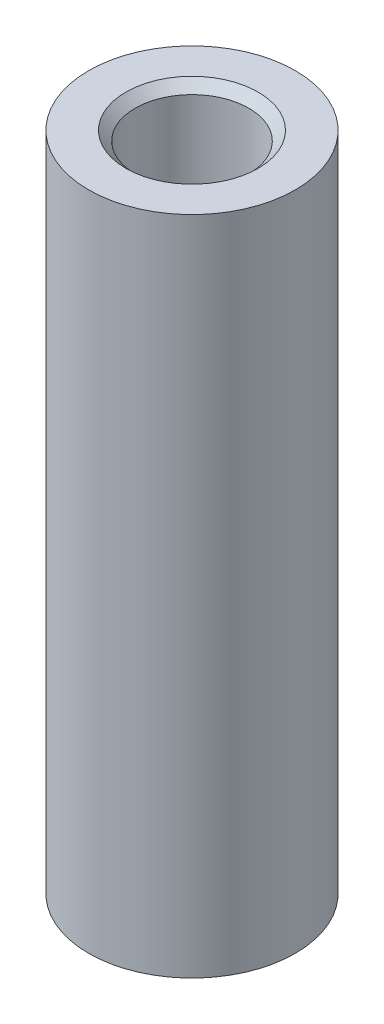
ISO-10303-21;
HEADER;
FILE_DESCRIPTION(('STEP AP214'),'2;1');
FILE_NAME('part.step','',(''),(''),'','','');
FILE_SCHEMA(('AUTOMOTIVE_DESIGN { 1 0 10303 214 1 1 1 1 }'));
ENDSEC;
DATA;
#1=APPLICATION_CONTEXT('core data for automotive mechanical design processes');
#2=APPLICATION_PROTOCOL_DEFINITION('international standard','automotive_design',2000,#1);
#3=PRODUCT_CONTEXT('',#1,'mechanical');
#4=PRODUCT('Part','Part','',(#3));
#5=PRODUCT_RELATED_PRODUCT_CATEGORY('part','',(#4));
#6=PRODUCT_DEFINITION_FORMATION('','',#4);
#7=PRODUCT_DEFINITION_CONTEXT('part definition',#1,'design');
#8=PRODUCT_DEFINITION('design','',#6,#7);
#9=PRODUCT_DEFINITION_SHAPE('','',#8);
#10=(LENGTH_UNIT() NAMED_UNIT(*) SI_UNIT(.MILLI.,.METRE.));
#11=(NAMED_UNIT(*) PLANE_ANGLE_UNIT() SI_UNIT($,.RADIAN.));
#12=(NAMED_UNIT(*) SI_UNIT($,.STERADIAN.) SOLID_ANGLE_UNIT());
#13=UNCERTAINTY_MEASURE_WITH_UNIT(LENGTH_MEASURE(1.E-05),#10,'distance_accuracy_value','');
#14=(GEOMETRIC_REPRESENTATION_CONTEXT(3) GLOBAL_UNCERTAINTY_ASSIGNED_CONTEXT((#13)) GLOBAL_UNIT_ASSIGNED_CONTEXT((#10,
#11,#12)) REPRESENTATION_CONTEXT('',''));
#15=CARTESIAN_POINT('',(0.,0.,0.));
#16=DIRECTION('',(0.,0.,1.));
#17=DIRECTION('',(1.,0.,0.));
#18=AXIS2_PLACEMENT_3D('',#15,#16,#17);
#19=CARTESIAN_POINT('',(0.,101.6,0.));
#20=DIRECTION('',(0.,-1.,0.));
#21=DIRECTION('',(0.,0.,-1.));
#22=AXIS2_PLACEMENT_3D('',#19,#20,#21);
#23=CYLINDRICAL_SURFACE('',#22,15.875);
#24=CARTESIAN_POINT('',(0.,101.6,0.));
#25=DIRECTION('',(0.,1.,0.));
#26=DIRECTION('',(0.,0.,1.));
#27=AXIS2_PLACEMENT_3D('',#24,#25,#26);
#28=CIRCLE('',#27,15.875);
#29=CARTESIAN_POINT('',(0.,101.6,15.875));
#30=VERTEX_POINT('',#29);
#31=EDGE_CURVE('E11',#30,#30,#28,.T.);
#32=ORIENTED_EDGE('',*,*,#31,.F.);
#33=EDGE_LOOP('',(#32));
#34=FACE_BOUND('',#33,.T.);
#35=CARTESIAN_POINT('',(0.,0.,0.));
#36=DIRECTION('',(0.,1.,0.));
#37=DIRECTION('',(0.,0.,1.));
#38=AXIS2_PLACEMENT_3D('',#35,#36,#37);
#39=CIRCLE('',#38,15.875);
#40=CARTESIAN_POINT('',(0.,0.,15.875));
#41=VERTEX_POINT('',#40);
#42=EDGE_CURVE('E46',#41,#41,#39,.T.);
#43=ORIENTED_EDGE('',*,*,#42,.T.);
#44=EDGE_LOOP('',(#43));
#45=FACE_BOUND('',#44,.T.);
#46=ADVANCED_FACE('F43',(#34,#45),#23,.T.);
#47=CARTESIAN_POINT('',(0.,101.6,0.));
#48=DIRECTION('',(0.,1.,0.));
#49=DIRECTION('',(0.,0.,1.));
#50=AXIS2_PLACEMENT_3D('',#47,#48,#49);
#51=PLANE('',#50);
#52=CARTESIAN_POINT('',(0.,101.6,0.));
#53=DIRECTION('',(0.,1.,0.));
#54=DIRECTION('',(0.,0.,1.));
#55=AXIS2_PLACEMENT_3D('',#52,#53,#54);
#56=CIRCLE('',#55,10.16);
#57=CARTESIAN_POINT('',(0.,101.6,10.16));
#58=VERTEX_POINT('',#57);
#59=EDGE_CURVE('E73',#58,#58,#56,.T.);
#60=ORIENTED_EDGE('',*,*,#59,.F.);
#61=EDGE_LOOP('',(#60));
#62=FACE_BOUND('',#61,.T.);
#63=ORIENTED_EDGE('',*,*,#31,.T.);
#64=EDGE_LOOP('',(#63));
#65=FACE_BOUND('',#64,.T.);
#66=ADVANCED_FACE('F87',(#62,#65),#51,.T.);
#67=CARTESIAN_POINT('',(0.,0.,0.));
#68=DIRECTION('',(0.,1.,0.));
#69=DIRECTION('',(0.,0.,1.));
#70=AXIS2_PLACEMENT_3D('',#67,#68,#69);
#71=PLANE('',#70);
#72=CARTESIAN_POINT('',(0.,0.,0.));
#73=DIRECTION('',(0.,-1.,0.));
#74=DIRECTION('',(0.,0.,-1.));
#75=AXIS2_PLACEMENT_3D('',#72,#73,#74);
#76=CIRCLE('',#75,6.35);
#77=CARTESIAN_POINT('',(0.,0.,-6.35));
#78=VERTEX_POINT('',#77);
#79=EDGE_CURVE('E70',#78,#78,#76,.T.);
#80=ORIENTED_EDGE('',*,*,#79,.F.);
#81=EDGE_LOOP('',(#80));
#82=FACE_BOUND('',#81,.T.);
#83=ORIENTED_EDGE('',*,*,#42,.F.);
#84=EDGE_LOOP('',(#83));
#85=FACE_BOUND('',#84,.T.);
#86=ADVANCED_FACE('F84',(#82,#85),#71,.F.);
#87=CARTESIAN_POINT('',(0.,0.,0.));
#88=DIRECTION('',(0.,-1.,0.));
#89=DIRECTION('',(0.,0.,-1.));
#90=AXIS2_PLACEMENT_3D('',#87,#88,#89);
#91=CYLINDRICAL_SURFACE('',#90,6.35);
#92=CARTESIAN_POINT('',(0.,4.86265714149235,0.));
#93=DIRECTION('',(0.,-1.,0.));
#94=DIRECTION('',(0.,0.,-1.));
#95=AXIS2_PLACEMENT_3D('',#92,#93,#94);
#96=CIRCLE('',#95,6.35);
#97=CARTESIAN_POINT('',(0.,4.86265714149235,-6.35));
#98=VERTEX_POINT('',#97);
#99=EDGE_CURVE('E66',#98,#98,#96,.T.);
#100=ORIENTED_EDGE('',*,*,#99,.F.);
#101=EDGE_LOOP('',(#100));
#102=FACE_BOUND('',#101,.T.);
#103=ORIENTED_EDGE('',*,*,#79,.T.);
#104=EDGE_LOOP('',(#103));
#105=FACE_BOUND('',#104,.T.);
#106=ADVANCED_FACE('F86',(#102,#105),#91,.F.);
#107=CARTESIAN_POINT('',(0.,4.86265714149235,0.));
#108=DIRECTION('',(0.,-1.,0.));
#109=DIRECTION('',(0.,0.,-1.));
#110=AXIS2_PLACEMENT_3D('',#107,#108,#109);
#111=CONICAL_SURFACE('',#110,6.35,1.02974425867666);
#112=CARTESIAN_POINT('',(0.,8.67812207231733,0.));
#113=VERTEX_POINT('',#112);
#114=VERTEX_LOOP('',#113);
#115=FACE_BOUND('',#114,.T.);
#116=ORIENTED_EDGE('',*,*,#99,.T.);
#117=EDGE_LOOP('',(#116));
#118=FACE_BOUND('',#117,.T.);
#119=ADVANCED_FACE('F60',(#115,#118),#111,.F.);
#120=CARTESIAN_POINT('',(0.,58.674,0.));
#121=DIRECTION('',(0.,1.,0.));
#122=DIRECTION('',(0.,0.,1.));
#123=AXIS2_PLACEMENT_3D('',#120,#121,#122);
#124=CONICAL_SURFACE('',#123,8.73124999999999,1.02974425867665);
#125=CARTESIAN_POINT('',(0.,53.4277357201156,0.));
#126=VERTEX_POINT('',#125);
#127=VERTEX_LOOP('',#126);
#128=FACE_BOUND('',#127,.T.);
#129=CARTESIAN_POINT('',(0.,58.674,0.));
#130=DIRECTION('',(0.,1.,0.));
#131=DIRECTION('',(0.,0.,1.));
#132=AXIS2_PLACEMENT_3D('',#129,#130,#131);
#133=CIRCLE('',#132,8.73124999999999);
#134=CARTESIAN_POINT('',(0.,58.674,8.73124999999999));
#135=VERTEX_POINT('',#134);
#136=EDGE_CURVE('E64',#135,#135,#133,.T.);
#137=ORIENTED_EDGE('',*,*,#136,.T.);
#138=EDGE_LOOP('',(#137));
#139=FACE_BOUND('',#138,.T.);
#140=ADVANCED_FACE('F56',(#128,#139),#124,.F.);
#141=CARTESIAN_POINT('',(0.,101.6,0.));
#142=DIRECTION('',(0.,1.,0.));
#143=DIRECTION('',(0.,0.,1.));
#144=AXIS2_PLACEMENT_3D('',#141,#142,#143);
#145=CYLINDRICAL_SURFACE('',#144,8.73124999999999);
#146=ORIENTED_EDGE('',*,*,#136,.F.);
#147=EDGE_LOOP('',(#146));
#148=FACE_BOUND('',#147,.T.);
#149=CARTESIAN_POINT('',(0.,100.17125,0.));
#150=DIRECTION('',(0.,1.,0.));
#151=DIRECTION('',(0.,0.,1.));
#152=AXIS2_PLACEMENT_3D('',#149,#150,#151);
#153=CIRCLE('',#152,8.73124999999999);
#154=CARTESIAN_POINT('',(0.,100.17125,8.73124999999999));
#155=VERTEX_POINT('',#154);
#156=EDGE_CURVE('E67',#155,#155,#153,.T.);
#157=ORIENTED_EDGE('',*,*,#156,.T.);
#158=EDGE_LOOP('',(#157));
#159=FACE_BOUND('',#158,.T.);
#160=ADVANCED_FACE('F59',(#148,#159),#145,.F.);
#161=CARTESIAN_POINT('',(0.,101.6,0.));
#162=DIRECTION('',(0.,1.,0.));
#163=DIRECTION('',(0.,0.,1.));
#164=AXIS2_PLACEMENT_3D('',#161,#162,#163);
#165=CONICAL_SURFACE('',#164,10.16,0.785398163397449);
#166=ORIENTED_EDGE('',*,*,#156,.F.);
#167=EDGE_LOOP('',(#166));
#168=FACE_BOUND('',#167,.T.);
#169=ORIENTED_EDGE('',*,*,#59,.T.);
#170=EDGE_LOOP('',(#169));
#171=FACE_BOUND('',#170,.T.);
#172=ADVANCED_FACE('F145',(#168,#171),#165,.F.);
#173=CLOSED_SHELL('',(#46,#66,#86,#106,#119,#140,#160,#172));
#174=MANIFOLD_SOLID_BREP('B2',#173);
#175=ADVANCED_BREP_SHAPE_REPRESENTATION('',(#18,#174),#14);
#176=SHAPE_DEFINITION_REPRESENTATION(#9,#175);
ENDSEC;
END-ISO-10303-21;
